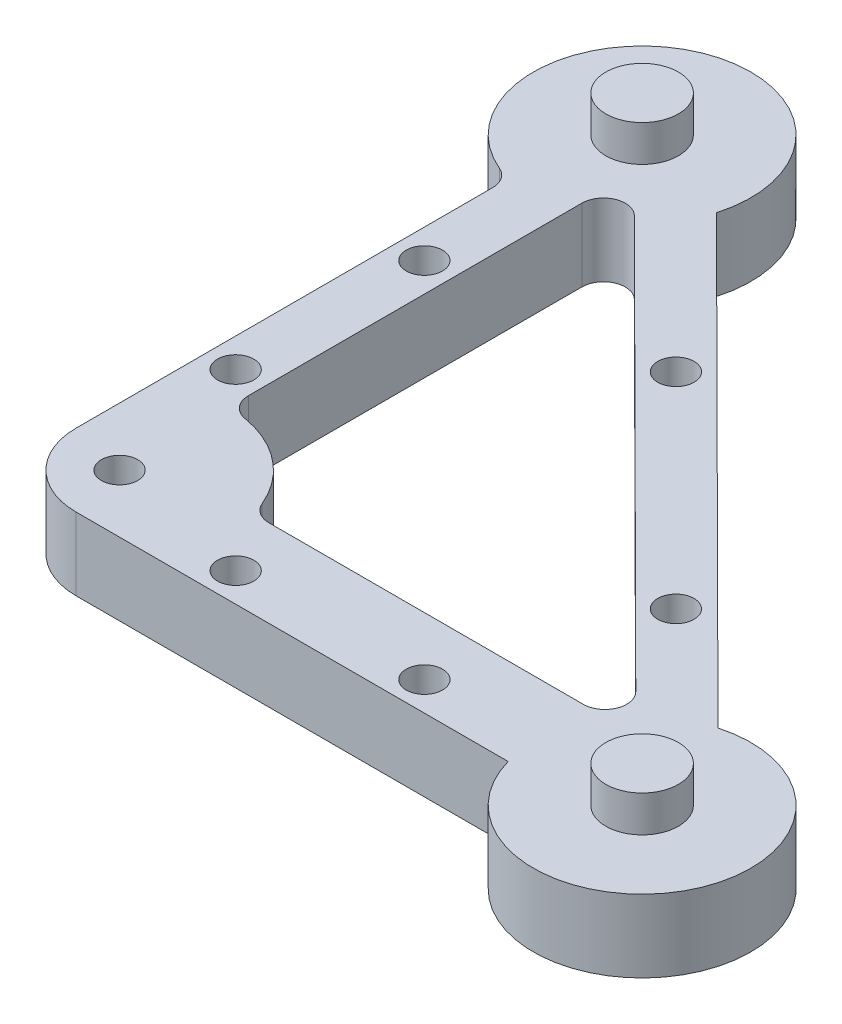
ISO-10303-21;
HEADER;
FILE_DESCRIPTION(('STEP AP214'),'2;1');
FILE_NAME('part.step','',(''),(''),'','','');
FILE_SCHEMA(('AUTOMOTIVE_DESIGN { 1 0 10303 214 1 1 1 1 }'));
ENDSEC;
DATA;
#1=APPLICATION_CONTEXT('core data for automotive mechanical design processes');
#2=APPLICATION_PROTOCOL_DEFINITION('international standard','automotive_design',2000,#1);
#3=PRODUCT_CONTEXT('',#1,'mechanical');
#4=PRODUCT('Part','Part','',(#3));
#5=PRODUCT_RELATED_PRODUCT_CATEGORY('part','',(#4));
#6=PRODUCT_DEFINITION_FORMATION('','',#4);
#7=PRODUCT_DEFINITION_CONTEXT('part definition',#1,'design');
#8=PRODUCT_DEFINITION('design','',#6,#7);
#9=PRODUCT_DEFINITION_SHAPE('','',#8);
#10=(LENGTH_UNIT() NAMED_UNIT(*) SI_UNIT(.MILLI.,.METRE.));
#11=(NAMED_UNIT(*) PLANE_ANGLE_UNIT() SI_UNIT($,.RADIAN.));
#12=(NAMED_UNIT(*) SI_UNIT($,.STERADIAN.) SOLID_ANGLE_UNIT());
#13=UNCERTAINTY_MEASURE_WITH_UNIT(LENGTH_MEASURE(1.E-05),#10,'distance_accuracy_value','');
#14=(GEOMETRIC_REPRESENTATION_CONTEXT(3) GLOBAL_UNCERTAINTY_ASSIGNED_CONTEXT((#13)) GLOBAL_UNIT_ASSIGNED_CONTEXT((#10,
#11,#12)) REPRESENTATION_CONTEXT('',''));
#15=CARTESIAN_POINT('',(0.,0.,0.));
#16=DIRECTION('',(0.,0.,1.));
#17=DIRECTION('',(1.,0.,0.));
#18=AXIS2_PLACEMENT_3D('',#15,#16,#17);
#19=CARTESIAN_POINT('',(-40.,10.,-80.));
#20=DIRECTION('',(0.,-1.,0.));
#21=DIRECTION('',(0.,0.,-1.));
#22=AXIS2_PLACEMENT_3D('',#19,#20,#21);
#23=CYLINDRICAL_SURFACE('',#22,15.);
#24=CARTESIAN_POINT('',(-40.,0.,-80.));
#25=DIRECTION('',(0.,1.,0.));
#26=DIRECTION('',(0.,0.,1.));
#27=AXIS2_PLACEMENT_3D('',#24,#25,#26);
#28=CIRCLE('',#27,15.);
#29=CARTESIAN_POINT('',(-25.5900581810937,0.,-75.8342375516917));
#30=VERTEX_POINT('',#29);
#31=CARTESIAN_POINT('',(-45.8333333333333,0.,-66.1807300401858));
#32=VERTEX_POINT('',#31);
#33=EDGE_CURVE('E178',#30,#32,#28,.T.);
#34=ORIENTED_EDGE('',*,*,#33,.T.);
#35=DIRECTION('',(0.,-1.,0.));
#36=VECTOR('',#35,1.);
#37=CARTESIAN_POINT('',(-45.8333333333333,10.,-66.1807300401858));
#38=LINE('',#37,#36);
#39=CARTESIAN_POINT('',(-45.8333333333333,10.,-66.1807300401858));
#40=VERTEX_POINT('',#39);
#41=EDGE_CURVE('E194',#32,#40,#38,.F.);
#42=ORIENTED_EDGE('',*,*,#41,.T.);
#43=CARTESIAN_POINT('',(-40.,10.,-80.));
#44=DIRECTION('',(0.,1.,0.));
#45=DIRECTION('',(0.,0.,1.));
#46=AXIS2_PLACEMENT_3D('',#43,#44,#45);
#47=CIRCLE('',#46,15.);
#48=CARTESIAN_POINT('',(-25.5900581810937,10.,-75.8342375516917));
#49=VERTEX_POINT('',#48);
#50=EDGE_CURVE('E172',#49,#40,#47,.T.);
#51=ORIENTED_EDGE('',*,*,#50,.F.);
#52=DIRECTION('',(0.,-1.,0.));
#53=VECTOR('',#52,1.);
#54=CARTESIAN_POINT('',(-25.5900581810937,10.,-75.8342375516917));
#55=LINE('',#54,#53);
#56=EDGE_CURVE('E177',#49,#30,#55,.T.);
#57=ORIENTED_EDGE('',*,*,#56,.T.);
#58=EDGE_LOOP('',(#34,#42,#51,#57));
#59=FACE_BOUND('',#58,.T.);
#60=ADVANCED_FACE('F39',(#59),#23,.T.);
#61=CARTESIAN_POINT('',(-44.,10.,-65.543167705199));
#62=DIRECTION('',(1.,0.,0.));
#63=DIRECTION('',(0.,0.,-1.));
#64=AXIS2_PLACEMENT_3D('',#61,#62,#63);
#65=PLANE('',#64);
#66=DIRECTION('',(0.,0.,1.));
#67=VECTOR('',#66,1.);
#68=CARTESIAN_POINT('',(-44.,0.,-65.543167705199));
#69=LINE('',#68,#67);
#70=CARTESIAN_POINT('',(-44.,0.,-63.416876048223));
#71=VERTEX_POINT('',#70);
#72=CARTESIAN_POINT('',(-44.,0.,-6.));
#73=VERTEX_POINT('',#72);
#74=EDGE_CURVE('E181',#71,#73,#69,.T.);
#75=ORIENTED_EDGE('',*,*,#74,.T.);
#76=DIRECTION('',(0.,-1.,0.));
#77=VECTOR('',#76,1.);
#78=CARTESIAN_POINT('',(-44.,10.,-6.));
#79=LINE('',#78,#77);
#80=CARTESIAN_POINT('',(-44.,10.,-6.));
#81=VERTEX_POINT('',#80);
#82=EDGE_CURVE('E47',#73,#81,#79,.F.);
#83=ORIENTED_EDGE('',*,*,#82,.T.);
#84=DIRECTION('',(0.,0.,1.));
#85=VECTOR('',#84,1.);
#86=CARTESIAN_POINT('',(-44.,10.,-65.543167705199));
#87=LINE('',#86,#85);
#88=CARTESIAN_POINT('',(-44.,10.,-63.416876048223));
#89=VERTEX_POINT('',#88);
#90=EDGE_CURVE('E170',#89,#81,#87,.T.);
#91=ORIENTED_EDGE('',*,*,#90,.F.);
#92=DIRECTION('',(0.,1.,0.));
#93=VECTOR('',#92,1.);
#94=CARTESIAN_POINT('',(-44.,0.,-63.416876048223));
#95=LINE('',#94,#93);
#96=EDGE_CURVE('E157',#89,#71,#95,.F.);
#97=ORIENTED_EDGE('',*,*,#96,.T.);
#98=EDGE_LOOP('',(#75,#83,#91,#97));
#99=FACE_BOUND('',#98,.T.);
#100=ADVANCED_FACE('F256',(#99),#65,.F.);
#101=CARTESIAN_POINT('',(25.543167705199,10.,4.));
#102=DIRECTION('',(0.,0.,1.));
#103=DIRECTION('',(1.,0.,0.));
#104=AXIS2_PLACEMENT_3D('',#101,#102,#103);
#105=PLANE('',#104);
#106=DIRECTION('',(-1.,0.,0.));
#107=VECTOR('',#106,1.);
#108=CARTESIAN_POINT('',(25.543167705199,10.,4.));
#109=LINE('',#108,#107);
#110=CARTESIAN_POINT('',(25.543167705199,10.,4.));
#111=VERTEX_POINT('',#110);
#112=CARTESIAN_POINT('',(-34.,10.,4.));
#113=VERTEX_POINT('',#112);
#114=EDGE_CURVE('E151',#111,#113,#109,.T.);
#115=ORIENTED_EDGE('',*,*,#114,.T.);
#116=DIRECTION('',(0.,-1.,0.));
#117=VECTOR('',#116,1.);
#118=CARTESIAN_POINT('',(-34.,0.,4.));
#119=LINE('',#118,#117);
#120=CARTESIAN_POINT('',(-34.,0.,4.));
#121=VERTEX_POINT('',#120);
#122=EDGE_CURVE('E240',#113,#121,#119,.T.);
#123=ORIENTED_EDGE('',*,*,#122,.T.);
#124=DIRECTION('',(-1.,0.,0.));
#125=VECTOR('',#124,1.);
#126=CARTESIAN_POINT('',(25.543167705199,0.,4.));
#127=LINE('',#126,#125);
#128=CARTESIAN_POINT('',(25.543167705199,0.,4.));
#129=VERTEX_POINT('',#128);
#130=EDGE_CURVE('E153',#129,#121,#127,.T.);
#131=ORIENTED_EDGE('',*,*,#130,.F.);
#132=DIRECTION('',(0.,-1.,0.));
#133=VECTOR('',#132,1.);
#134=CARTESIAN_POINT('',(25.543167705199,10.,4.));
#135=LINE('',#134,#133);
#136=EDGE_CURVE('E146',#111,#129,#135,.T.);
#137=ORIENTED_EDGE('',*,*,#136,.F.);
#138=EDGE_LOOP('',(#115,#123,#131,#137));
#139=FACE_BOUND('',#138,.T.);
#140=ADVANCED_FACE('F148',(#139),#105,.T.);
#141=CARTESIAN_POINT('',(40.,10.,0.));
#142=DIRECTION('',(0.,-1.,0.));
#143=DIRECTION('',(0.,0.,-1.));
#144=AXIS2_PLACEMENT_3D('',#141,#142,#143);
#145=CYLINDRICAL_SURFACE('',#144,15.);
#146=CARTESIAN_POINT('',(40.,0.,0.));
#147=DIRECTION('',(0.,1.,0.));
#148=DIRECTION('',(0.,0.,1.));
#149=AXIS2_PLACEMENT_3D('',#146,#147,#148);
#150=CIRCLE('',#149,15.);
#151=CARTESIAN_POINT('',(36.,0.,-14.456832294801));
#152=VERTEX_POINT('',#151);
#153=EDGE_CURVE('E185',#129,#152,#150,.T.);
#154=ORIENTED_EDGE('',*,*,#153,.T.);
#155=DIRECTION('',(0.,-1.,0.));
#156=VECTOR('',#155,1.);
#157=CARTESIAN_POINT('',(36.,10.,-14.456832294801));
#158=LINE('',#157,#156);
#159=CARTESIAN_POINT('',(36.,10.,-14.456832294801));
#160=VERTEX_POINT('',#159);
#161=EDGE_CURVE('E158',#160,#152,#158,.T.);
#162=ORIENTED_EDGE('',*,*,#161,.F.);
#163=CARTESIAN_POINT('',(40.,10.,0.));
#164=DIRECTION('',(0.,1.,0.));
#165=DIRECTION('',(0.,0.,1.));
#166=AXIS2_PLACEMENT_3D('',#163,#164,#165);
#167=CIRCLE('',#166,15.);
#168=EDGE_CURVE('E161',#111,#160,#167,.T.);
#169=ORIENTED_EDGE('',*,*,#168,.F.);
#170=ORIENTED_EDGE('',*,*,#136,.T.);
#171=EDGE_LOOP('',(#154,#162,#169,#170));
#172=FACE_BOUND('',#171,.T.);
#173=ADVANCED_FACE('F162',(#172),#145,.T.);
#174=CARTESIAN_POINT('',(-25.5900581810937,10.,-75.8342375516917));
#175=DIRECTION('',(0.705882895496767,0.,-0.708328552188249));
#176=DIRECTION('',(-0.708328552188249,0.,-0.705882895496767));
#177=AXIS2_PLACEMENT_3D('',#174,#175,#176);
#178=PLANE('',#177);
#179=DIRECTION('',(0.708328552188249,0.,0.705882895496767));
#180=VECTOR('',#179,1.);
#181=CARTESIAN_POINT('',(-25.5900581810937,0.,-75.8342375516917));
#182=LINE('',#181,#180);
#183=EDGE_CURVE('E187',#30,#152,#182,.T.);
#184=ORIENTED_EDGE('',*,*,#183,.F.);
#185=ORIENTED_EDGE('',*,*,#56,.F.);
#186=DIRECTION('',(0.708328552188249,0.,0.705882895496767));
#187=VECTOR('',#186,1.);
#188=CARTESIAN_POINT('',(-25.5900581810937,10.,-75.8342375516917));
#189=LINE('',#188,#187);
#190=EDGE_CURVE('E166',#49,#160,#189,.T.);
#191=ORIENTED_EDGE('',*,*,#190,.T.);
#192=ORIENTED_EDGE('',*,*,#161,.T.);
#193=EDGE_LOOP('',(#184,#185,#191,#192));
#194=FACE_BOUND('',#193,.T.);
#195=ADVANCED_FACE('F247',(#194),#178,.T.);
#196=CARTESIAN_POINT('',(-40.,10.,-80.));
#197=DIRECTION('',(0.,1.,0.));
#198=DIRECTION('',(0.,0.,1.));
#199=AXIS2_PLACEMENT_3D('',#196,#197,#198);
#200=PLANE('',#199);
#201=CARTESIAN_POINT('',(18.8861263291783,10.,-25.7668706084866));
#202=DIRECTION('',(0.,1.,0.));
#203=DIRECTION('',(0.,0.,1.));
#204=AXIS2_PLACEMENT_3D('',#201,#202,#203);
#205=CIRCLE('',#204,2.5);
#206=CARTESIAN_POINT('',(18.8861263291783,10.,-23.2668706084866));
#207=VERTEX_POINT('',#206);
#208=EDGE_CURVE('E633',#207,#207,#205,.T.);
#209=ORIENTED_EDGE('',*,*,#208,.F.);
#210=EDGE_LOOP('',(#209));
#211=FACE_BOUND('',#210,.T.);
#212=CARTESIAN_POINT('',(-9.39814491828355,10.,-54.0511418559485));
#213=DIRECTION('',(0.,1.,0.));
#214=DIRECTION('',(0.,0.,1.));
#215=AXIS2_PLACEMENT_3D('',#212,#213,#214);
#216=CIRCLE('',#215,2.5);
#217=CARTESIAN_POINT('',(-9.39814491828355,10.,-51.5511418559485));
#218=VERTEX_POINT('',#217);
#219=EDGE_CURVE('E635',#218,#218,#216,.T.);
#220=ORIENTED_EDGE('',*,*,#219,.F.);
#221=EDGE_LOOP('',(#220));
#222=FACE_BOUND('',#221,.T.);
#223=CARTESIAN_POINT('',(-36.,10.,-4.));
#224=DIRECTION('',(0.,-1.,0.));
#225=DIRECTION('',(0.,0.,1.));
#226=AXIS2_PLACEMENT_3D('',#223,#224,#225);
#227=CIRCLE('',#226,15.);
#228=CARTESIAN_POINT('',(-33.5,10.,-18.790199457749));
#229=VERTEX_POINT('',#228);
#230=CARTESIAN_POINT('',(-22.1807300401858,10.,-9.83333333333333));
#231=VERTEX_POINT('',#230);
#232=EDGE_CURVE('E312',#229,#231,#227,.T.);
#233=ORIENTED_EDGE('',*,*,#232,.F.);
#234=CARTESIAN_POINT('',(-33.,10.,-21.7482393492988));
#235=DIRECTION('',(0.,1.,0.));
#236=DIRECTION('',(0.,0.,1.));
#237=AXIS2_PLACEMENT_3D('',#234,#235,#236);
#238=CIRCLE('',#237,3.);
#239=CARTESIAN_POINT('',(-36.,10.,-21.7482393492988));
#240=VERTEX_POINT('',#239);
#241=EDGE_CURVE('E227',#229,#240,#238,.F.);
#242=ORIENTED_EDGE('',*,*,#241,.T.);
#243=DIRECTION('',(0.,0.,1.));
#244=VECTOR('',#243,1.);
#245=CARTESIAN_POINT('',(-36.,10.,-74.9140429260424));
#246=LINE('',#245,#244);
#247=CARTESIAN_POINT('',(-36.,10.,-67.6890783659095));
#248=VERTEX_POINT('',#247);
#249=EDGE_CURVE('E305',#248,#240,#246,.T.);
#250=ORIENTED_EDGE('',*,*,#249,.F.);
#251=CARTESIAN_POINT('',(-33.,10.,-67.6890783659095));
#252=DIRECTION('',(0.,1.,0.));
#253=DIRECTION('',(0.,0.,1.));
#254=AXIS2_PLACEMENT_3D('',#251,#252,#253);
#255=CIRCLE('',#254,3.);
#256=CARTESIAN_POINT('',(-30.8823513135097,10.,-69.8140640224743));
#257=VERTEX_POINT('',#256);
#258=EDGE_CURVE('E206',#248,#257,#255,.F.);
#259=ORIENTED_EDGE('',*,*,#258,.T.);
#260=DIRECTION('',(-0.708328552188249,0.,-0.705882895496767));
#261=VECTOR('',#260,1.);
#262=CARTESIAN_POINT('',(-36.,10.,-74.9140429260424));
#263=LINE('',#262,#261);
#264=CARTESIAN_POINT('',(26.0031364352083,10.,-13.1249856565647));
#265=VERTEX_POINT('',#264);
#266=EDGE_CURVE('E318',#265,#257,#263,.T.);
#267=ORIENTED_EDGE('',*,*,#266,.F.);
#268=CARTESIAN_POINT('',(23.8854877487179,10.,-11.));
#269=DIRECTION('',(0.,1.,0.));
#270=DIRECTION('',(0.,0.,1.));
#271=AXIS2_PLACEMENT_3D('',#268,#269,#270);
#272=CIRCLE('',#271,3.);
#273=CARTESIAN_POINT('',(23.8854877487179,10.,-7.99999999999999));
#274=VERTEX_POINT('',#273);
#275=EDGE_CURVE('E217',#265,#274,#272,.F.);
#276=ORIENTED_EDGE('',*,*,#275,.T.);
#277=DIRECTION('',(1.,0.,0.));
#278=VECTOR('',#277,1.);
#279=CARTESIAN_POINT('',(-21.543167705199,10.,-7.99999999999999));
#280=LINE('',#279,#278);
#281=CARTESIAN_POINT('',(-19.416876048223,10.,-7.99999999999999));
#282=VERTEX_POINT('',#281);
#283=EDGE_CURVE('E315',#282,#274,#280,.T.);
#284=ORIENTED_EDGE('',*,*,#283,.F.);
#285=CARTESIAN_POINT('',(-19.416876048223,10.,-11.));
#286=DIRECTION('',(0.,1.,0.));
#287=DIRECTION('',(0.,0.,1.));
#288=AXIS2_PLACEMENT_3D('',#285,#286,#287);
#289=CIRCLE('',#288,3.);
#290=EDGE_CURVE('E236',#282,#231,#289,.F.);
#291=ORIENTED_EDGE('',*,*,#290,.T.);
#292=EDGE_LOOP('',(#233,#242,#250,#259,#267,#276,#284,#291));
#293=FACE_BOUND('',#292,.T.);
#294=CARTESIAN_POINT('',(-36.,10.,-4.));
#295=DIRECTION('',(0.,1.,0.));
#296=DIRECTION('',(0.,0.,1.));
#297=AXIS2_PLACEMENT_3D('',#294,#295,#296);
#298=CIRCLE('',#297,2.5);
#299=CARTESIAN_POINT('',(-36.,10.,-1.5));
#300=VERTEX_POINT('',#299);
#301=EDGE_CURVE('E311',#300,#300,#298,.T.);
#302=ORIENTED_EDGE('',*,*,#301,.F.);
#303=EDGE_LOOP('',(#302));
#304=FACE_BOUND('',#303,.T.);
#305=CARTESIAN_POINT('',(-16.,10.,0.));
#306=DIRECTION('',(0.,1.,0.));
#307=DIRECTION('',(0.,0.,1.));
#308=AXIS2_PLACEMENT_3D('',#305,#306,#307);
#309=CIRCLE('',#308,2.5);
#310=CARTESIAN_POINT('',(-16.,10.,2.5));
#311=VERTEX_POINT('',#310);
#312=EDGE_CURVE('E325',#311,#311,#309,.T.);
#313=ORIENTED_EDGE('',*,*,#312,.F.);
#314=EDGE_LOOP('',(#313));
#315=FACE_BOUND('',#314,.T.);
#316=CARTESIAN_POINT('',(10.,10.,0.));
#317=DIRECTION('',(0.,1.,0.));
#318=DIRECTION('',(0.,0.,1.));
#319=AXIS2_PLACEMENT_3D('',#316,#317,#318);
#320=CIRCLE('',#319,2.5);
#321=CARTESIAN_POINT('',(10.,10.,2.5));
#322=VERTEX_POINT('',#321);
#323=EDGE_CURVE('E331',#322,#322,#320,.T.);
#324=ORIENTED_EDGE('',*,*,#323,.F.);
#325=EDGE_LOOP('',(#324));
#326=FACE_BOUND('',#325,.T.);
#327=CARTESIAN_POINT('',(-40.,10.,-24.));
#328=DIRECTION('',(0.,1.,0.));
#329=DIRECTION('',(0.,0.,1.));
#330=AXIS2_PLACEMENT_3D('',#327,#328,#329);
#331=CIRCLE('',#330,2.5);
#332=CARTESIAN_POINT('',(-40.,10.,-21.5));
#333=VERTEX_POINT('',#332);
#334=EDGE_CURVE('E337',#333,#333,#331,.T.);
#335=ORIENTED_EDGE('',*,*,#334,.F.);
#336=EDGE_LOOP('',(#335));
#337=FACE_BOUND('',#336,.T.);
#338=CARTESIAN_POINT('',(-40.,10.,-50.));
#339=DIRECTION('',(0.,1.,0.));
#340=DIRECTION('',(0.,0.,1.));
#341=AXIS2_PLACEMENT_3D('',#338,#339,#340);
#342=CIRCLE('',#341,2.5);
#343=CARTESIAN_POINT('',(-40.,10.,-47.5));
#344=VERTEX_POINT('',#343);
#345=EDGE_CURVE('E343',#344,#344,#342,.T.);
#346=ORIENTED_EDGE('',*,*,#345,.F.);
#347=EDGE_LOOP('',(#346));
#348=FACE_BOUND('',#347,.T.);
#349=CARTESIAN_POINT('',(40.,10.,0.));
#350=DIRECTION('',(0.,1.,0.));
#351=DIRECTION('',(0.,0.,1.));
#352=AXIS2_PLACEMENT_3D('',#349,#350,#351);
#353=CIRCLE('',#352,5.);
#354=CARTESIAN_POINT('',(40.,10.,5.));
#355=VERTEX_POINT('',#354);
#356=EDGE_CURVE('E349',#355,#355,#353,.T.);
#357=ORIENTED_EDGE('',*,*,#356,.F.);
#358=EDGE_LOOP('',(#357));
#359=FACE_BOUND('',#358,.T.);
#360=CARTESIAN_POINT('',(-40.,10.,-80.));
#361=DIRECTION('',(0.,1.,0.));
#362=DIRECTION('',(0.,0.,1.));
#363=AXIS2_PLACEMENT_3D('',#360,#361,#362);
#364=CIRCLE('',#363,5.);
#365=CARTESIAN_POINT('',(-40.,10.,-75.));
#366=VERTEX_POINT('',#365);
#367=EDGE_CURVE('E355',#366,#366,#364,.T.);
#368=ORIENTED_EDGE('',*,*,#367,.F.);
#369=EDGE_LOOP('',(#368));
#370=FACE_BOUND('',#369,.T.);
#371=ORIENTED_EDGE('',*,*,#90,.T.);
#372=CARTESIAN_POINT('',(-34.,10.,-6.));
#373=DIRECTION('',(0.,1.,0.));
#374=DIRECTION('',(0.,0.,1.));
#375=AXIS2_PLACEMENT_3D('',#372,#373,#374);
#376=CIRCLE('',#375,10.);
#377=EDGE_CURVE('E11',#81,#113,#376,.T.);
#378=ORIENTED_EDGE('',*,*,#377,.T.);
#379=ORIENTED_EDGE('',*,*,#114,.F.);
#380=ORIENTED_EDGE('',*,*,#168,.T.);
#381=ORIENTED_EDGE('',*,*,#190,.F.);
#382=ORIENTED_EDGE('',*,*,#50,.T.);
#383=CARTESIAN_POINT('',(-47.,10.,-63.416876048223));
#384=DIRECTION('',(0.,1.,0.));
#385=DIRECTION('',(0.,0.,1.));
#386=AXIS2_PLACEMENT_3D('',#383,#384,#385);
#387=CIRCLE('',#386,3.);
#388=EDGE_CURVE('E198',#40,#89,#387,.F.);
#389=ORIENTED_EDGE('',*,*,#388,.T.);
#390=EDGE_LOOP('',(#371,#378,#379,#380,#381,#382,#389));
#391=FACE_BOUND('',#390,.T.);
#392=ADVANCED_FACE('F168',(#211,#222,#293,#304,#315,#326,#337,#348,#359,#370,#391),#200,.T.);
#393=CARTESIAN_POINT('',(-40.,0.,-80.));
#394=DIRECTION('',(0.,1.,0.));
#395=DIRECTION('',(0.,0.,1.));
#396=AXIS2_PLACEMENT_3D('',#393,#394,#395);
#397=PLANE('',#396);
#398=CARTESIAN_POINT('',(18.8861263291783,0.,-25.7668706084866));
#399=DIRECTION('',(0.,1.,0.));
#400=DIRECTION('',(0.,0.,1.));
#401=AXIS2_PLACEMENT_3D('',#398,#399,#400);
#402=CIRCLE('',#401,2.5);
#403=CARTESIAN_POINT('',(18.8861263291783,0.,-23.2668706084866));
#404=VERTEX_POINT('',#403);
#405=EDGE_CURVE('E631',#404,#404,#402,.T.);
#406=ORIENTED_EDGE('',*,*,#405,.T.);
#407=EDGE_LOOP('',(#406));
#408=FACE_BOUND('',#407,.T.);
#409=CARTESIAN_POINT('',(-9.39814491828355,0.,-54.0511418559485));
#410=DIRECTION('',(0.,1.,0.));
#411=DIRECTION('',(0.,0.,1.));
#412=AXIS2_PLACEMENT_3D('',#409,#410,#411);
#413=CIRCLE('',#412,2.5);
#414=CARTESIAN_POINT('',(-9.39814491828355,0.,-51.5511418559485));
#415=VERTEX_POINT('',#414);
#416=EDGE_CURVE('E316',#415,#415,#413,.T.);
#417=ORIENTED_EDGE('',*,*,#416,.T.);
#418=EDGE_LOOP('',(#417));
#419=FACE_BOUND('',#418,.T.);
#420=CARTESIAN_POINT('',(-36.,0.,-4.));
#421=DIRECTION('',(0.,-1.,0.));
#422=DIRECTION('',(0.,0.,1.));
#423=AXIS2_PLACEMENT_3D('',#420,#421,#422);
#424=CIRCLE('',#423,15.);
#425=CARTESIAN_POINT('',(-33.5,0.,-18.790199457749));
#426=VERTEX_POINT('',#425);
#427=CARTESIAN_POINT('',(-22.1807300401858,0.,-9.83333333333333));
#428=VERTEX_POINT('',#427);
#429=EDGE_CURVE('E296',#426,#428,#424,.T.);
#430=ORIENTED_EDGE('',*,*,#429,.T.);
#431=CARTESIAN_POINT('',(-19.416876048223,0.,-11.));
#432=DIRECTION('',(0.,1.,0.));
#433=DIRECTION('',(0.,0.,1.));
#434=AXIS2_PLACEMENT_3D('',#431,#432,#433);
#435=CIRCLE('',#434,3.);
#436=CARTESIAN_POINT('',(-19.416876048223,0.,-7.99999999999999));
#437=VERTEX_POINT('',#436);
#438=EDGE_CURVE('E238',#428,#437,#435,.T.);
#439=ORIENTED_EDGE('',*,*,#438,.T.);
#440=DIRECTION('',(1.,0.,0.));
#441=VECTOR('',#440,1.);
#442=CARTESIAN_POINT('',(-21.543167705199,0.,-7.99999999999999));
#443=LINE('',#442,#441);
#444=CARTESIAN_POINT('',(23.8854877487179,0.,-7.99999999999999));
#445=VERTEX_POINT('',#444);
#446=EDGE_CURVE('E294',#437,#445,#443,.T.);
#447=ORIENTED_EDGE('',*,*,#446,.T.);
#448=CARTESIAN_POINT('',(23.8854877487179,0.,-11.));
#449=DIRECTION('',(0.,1.,0.));
#450=DIRECTION('',(0.,0.,1.));
#451=AXIS2_PLACEMENT_3D('',#448,#449,#450);
#452=CIRCLE('',#451,3.);
#453=CARTESIAN_POINT('',(26.0031364352083,0.,-13.1249856565647));
#454=VERTEX_POINT('',#453);
#455=EDGE_CURVE('E220',#445,#454,#452,.T.);
#456=ORIENTED_EDGE('',*,*,#455,.T.);
#457=DIRECTION('',(-0.708328552188249,0.,-0.705882895496767));
#458=VECTOR('',#457,1.);
#459=CARTESIAN_POINT('',(-36.,0.,-74.9140429260424));
#460=LINE('',#459,#458);
#461=CARTESIAN_POINT('',(-30.8823513135097,0.,-69.8140640224743));
#462=VERTEX_POINT('',#461);
#463=EDGE_CURVE('E301',#454,#462,#460,.T.);
#464=ORIENTED_EDGE('',*,*,#463,.T.);
#465=CARTESIAN_POINT('',(-33.,0.,-67.6890783659095));
#466=DIRECTION('',(0.,1.,0.));
#467=DIRECTION('',(0.,0.,1.));
#468=AXIS2_PLACEMENT_3D('',#465,#466,#467);
#469=CIRCLE('',#468,3.);
#470=CARTESIAN_POINT('',(-36.,0.,-67.6890783659095));
#471=VERTEX_POINT('',#470);
#472=EDGE_CURVE('E209',#462,#471,#469,.T.);
#473=ORIENTED_EDGE('',*,*,#472,.T.);
#474=DIRECTION('',(0.,0.,1.));
#475=VECTOR('',#474,1.);
#476=CARTESIAN_POINT('',(-36.,0.,-74.9140429260424));
#477=LINE('',#476,#475);
#478=CARTESIAN_POINT('',(-36.,0.,-21.7482393492988));
#479=VERTEX_POINT('',#478);
#480=EDGE_CURVE('E303',#471,#479,#477,.T.);
#481=ORIENTED_EDGE('',*,*,#480,.T.);
#482=CARTESIAN_POINT('',(-33.,0.,-21.7482393492988));
#483=DIRECTION('',(0.,1.,0.));
#484=DIRECTION('',(0.,0.,1.));
#485=AXIS2_PLACEMENT_3D('',#482,#483,#484);
#486=CIRCLE('',#485,3.);
#487=EDGE_CURVE('E229',#479,#426,#486,.T.);
#488=ORIENTED_EDGE('',*,*,#487,.T.);
#489=EDGE_LOOP('',(#430,#439,#447,#456,#464,#473,#481,#488));
#490=FACE_BOUND('',#489,.T.);
#491=CARTESIAN_POINT('',(-36.,0.,-4.));
#492=DIRECTION('',(0.,1.,0.));
#493=DIRECTION('',(0.,0.,1.));
#494=AXIS2_PLACEMENT_3D('',#491,#492,#493);
#495=CIRCLE('',#494,2.5);
#496=CARTESIAN_POINT('',(-36.,0.,-1.5));
#497=VERTEX_POINT('',#496);
#498=EDGE_CURVE('E322',#497,#497,#495,.T.);
#499=ORIENTED_EDGE('',*,*,#498,.T.);
#500=EDGE_LOOP('',(#499));
#501=FACE_BOUND('',#500,.T.);
#502=CARTESIAN_POINT('',(-16.,0.,0.));
#503=DIRECTION('',(0.,1.,0.));
#504=DIRECTION('',(0.,0.,1.));
#505=AXIS2_PLACEMENT_3D('',#502,#503,#504);
#506=CIRCLE('',#505,2.5);
#507=CARTESIAN_POINT('',(-16.,0.,2.5));
#508=VERTEX_POINT('',#507);
#509=EDGE_CURVE('E328',#508,#508,#506,.T.);
#510=ORIENTED_EDGE('',*,*,#509,.T.);
#511=EDGE_LOOP('',(#510));
#512=FACE_BOUND('',#511,.T.);
#513=CARTESIAN_POINT('',(10.,0.,0.));
#514=DIRECTION('',(0.,1.,0.));
#515=DIRECTION('',(0.,0.,1.));
#516=AXIS2_PLACEMENT_3D('',#513,#514,#515);
#517=CIRCLE('',#516,2.5);
#518=CARTESIAN_POINT('',(10.,0.,2.5));
#519=VERTEX_POINT('',#518);
#520=EDGE_CURVE('E334',#519,#519,#517,.T.);
#521=ORIENTED_EDGE('',*,*,#520,.T.);
#522=EDGE_LOOP('',(#521));
#523=FACE_BOUND('',#522,.T.);
#524=CARTESIAN_POINT('',(-40.,0.,-24.));
#525=DIRECTION('',(0.,1.,0.));
#526=DIRECTION('',(0.,0.,1.));
#527=AXIS2_PLACEMENT_3D('',#524,#525,#526);
#528=CIRCLE('',#527,2.5);
#529=CARTESIAN_POINT('',(-40.,0.,-21.5));
#530=VERTEX_POINT('',#529);
#531=EDGE_CURVE('E340',#530,#530,#528,.T.);
#532=ORIENTED_EDGE('',*,*,#531,.T.);
#533=EDGE_LOOP('',(#532));
#534=FACE_BOUND('',#533,.T.);
#535=CARTESIAN_POINT('',(-40.,0.,-50.));
#536=DIRECTION('',(0.,1.,0.));
#537=DIRECTION('',(0.,0.,1.));
#538=AXIS2_PLACEMENT_3D('',#535,#536,#537);
#539=CIRCLE('',#538,2.5);
#540=CARTESIAN_POINT('',(-40.,0.,-47.5));
#541=VERTEX_POINT('',#540);
#542=EDGE_CURVE('E346',#541,#541,#539,.T.);
#543=ORIENTED_EDGE('',*,*,#542,.T.);
#544=EDGE_LOOP('',(#543));
#545=FACE_BOUND('',#544,.T.);
#546=ORIENTED_EDGE('',*,*,#130,.T.);
#547=CARTESIAN_POINT('',(-34.,0.,-6.));
#548=DIRECTION('',(0.,1.,0.));
#549=DIRECTION('',(0.,0.,1.));
#550=AXIS2_PLACEMENT_3D('',#547,#548,#549);
#551=CIRCLE('',#550,10.);
#552=EDGE_CURVE('E61',#121,#73,#551,.F.);
#553=ORIENTED_EDGE('',*,*,#552,.T.);
#554=ORIENTED_EDGE('',*,*,#74,.F.);
#555=CARTESIAN_POINT('',(-47.,0.,-63.416876048223));
#556=DIRECTION('',(0.,1.,0.));
#557=DIRECTION('',(0.,0.,1.));
#558=AXIS2_PLACEMENT_3D('',#555,#556,#557);
#559=CIRCLE('',#558,3.);
#560=EDGE_CURVE('E196',#71,#32,#559,.T.);
#561=ORIENTED_EDGE('',*,*,#560,.T.);
#562=ORIENTED_EDGE('',*,*,#33,.F.);
#563=ORIENTED_EDGE('',*,*,#183,.T.);
#564=ORIENTED_EDGE('',*,*,#153,.F.);
#565=EDGE_LOOP('',(#546,#553,#554,#561,#562,#563,#564));
#566=FACE_BOUND('',#565,.T.);
#567=ADVANCED_FACE('F243',(#408,#419,#490,#501,#512,#523,#534,#545,#566),#397,.F.);
#568=CARTESIAN_POINT('',(-40.,15.,-80.));
#569=DIRECTION('',(0.,-1.,0.));
#570=DIRECTION('',(0.,0.,-1.));
#571=AXIS2_PLACEMENT_3D('',#568,#569,#570);
#572=CYLINDRICAL_SURFACE('',#571,5.);
#573=CARTESIAN_POINT('',(-40.,15.,-80.));
#574=DIRECTION('',(0.,1.,0.));
#575=DIRECTION('',(0.,0.,1.));
#576=AXIS2_PLACEMENT_3D('',#573,#574,#575);
#577=CIRCLE('',#576,5.);
#578=CARTESIAN_POINT('',(-40.,15.,-75.));
#579=VERTEX_POINT('',#578);
#580=EDGE_CURVE('E182',#579,#579,#577,.T.);
#581=ORIENTED_EDGE('',*,*,#580,.F.);
#582=EDGE_LOOP('',(#581));
#583=FACE_BOUND('',#582,.T.);
#584=ORIENTED_EDGE('',*,*,#367,.T.);
#585=EDGE_LOOP('',(#584));
#586=FACE_BOUND('',#585,.T.);
#587=ADVANCED_FACE('F363',(#583,#586),#572,.T.);
#588=CARTESIAN_POINT('',(-40.,15.,-80.));
#589=DIRECTION('',(0.,1.,0.));
#590=DIRECTION('',(0.,0.,1.));
#591=AXIS2_PLACEMENT_3D('',#588,#589,#590);
#592=PLANE('',#591);
#593=ORIENTED_EDGE('',*,*,#580,.T.);
#594=EDGE_LOOP('',(#593));
#595=FACE_BOUND('',#594,.T.);
#596=ADVANCED_FACE('F404',(#595),#592,.T.);
#597=CARTESIAN_POINT('',(40.,15.,0.));
#598=DIRECTION('',(0.,-1.,0.));
#599=DIRECTION('',(0.,0.,-1.));
#600=AXIS2_PLACEMENT_3D('',#597,#598,#599);
#601=CYLINDRICAL_SURFACE('',#600,5.);
#602=CARTESIAN_POINT('',(40.,15.,0.));
#603=DIRECTION('',(0.,1.,0.));
#604=DIRECTION('',(0.,0.,1.));
#605=AXIS2_PLACEMENT_3D('',#602,#603,#604);
#606=CIRCLE('',#605,5.);
#607=CARTESIAN_POINT('',(40.,15.,5.));
#608=VERTEX_POINT('',#607);
#609=EDGE_CURVE('E352',#608,#608,#606,.T.);
#610=ORIENTED_EDGE('',*,*,#609,.F.);
#611=EDGE_LOOP('',(#610));
#612=FACE_BOUND('',#611,.T.);
#613=ORIENTED_EDGE('',*,*,#356,.T.);
#614=EDGE_LOOP('',(#613));
#615=FACE_BOUND('',#614,.T.);
#616=ADVANCED_FACE('F414',(#612,#615),#601,.T.);
#617=CARTESIAN_POINT('',(40.,15.,0.));
#618=DIRECTION('',(0.,1.,0.));
#619=DIRECTION('',(0.,0.,1.));
#620=AXIS2_PLACEMENT_3D('',#617,#618,#619);
#621=PLANE('',#620);
#622=ORIENTED_EDGE('',*,*,#609,.T.);
#623=EDGE_LOOP('',(#622));
#624=FACE_BOUND('',#623,.T.);
#625=ADVANCED_FACE('F423',(#624),#621,.T.);
#626=CARTESIAN_POINT('',(-40.,0.,-50.));
#627=DIRECTION('',(0.,1.,0.));
#628=DIRECTION('',(0.,0.,1.));
#629=AXIS2_PLACEMENT_3D('',#626,#627,#628);
#630=CYLINDRICAL_SURFACE('',#629,2.5);
#631=ORIENTED_EDGE('',*,*,#542,.F.);
#632=EDGE_LOOP('',(#631));
#633=FACE_BOUND('',#632,.T.);
#634=ORIENTED_EDGE('',*,*,#345,.T.);
#635=EDGE_LOOP('',(#634));
#636=FACE_BOUND('',#635,.T.);
#637=ADVANCED_FACE('F433',(#633,#636),#630,.F.);
#638=CARTESIAN_POINT('',(-40.,0.,-24.));
#639=DIRECTION('',(0.,1.,0.));
#640=DIRECTION('',(0.,0.,1.));
#641=AXIS2_PLACEMENT_3D('',#638,#639,#640);
#642=CYLINDRICAL_SURFACE('',#641,2.5);
#643=ORIENTED_EDGE('',*,*,#531,.F.);
#644=EDGE_LOOP('',(#643));
#645=FACE_BOUND('',#644,.T.);
#646=ORIENTED_EDGE('',*,*,#334,.T.);
#647=EDGE_LOOP('',(#646));
#648=FACE_BOUND('',#647,.T.);
#649=ADVANCED_FACE('F443',(#645,#648),#642,.F.);
#650=CARTESIAN_POINT('',(10.,0.,0.));
#651=DIRECTION('',(0.,1.,0.));
#652=DIRECTION('',(0.,0.,1.));
#653=AXIS2_PLACEMENT_3D('',#650,#651,#652);
#654=CYLINDRICAL_SURFACE('',#653,2.5);
#655=ORIENTED_EDGE('',*,*,#520,.F.);
#656=EDGE_LOOP('',(#655));
#657=FACE_BOUND('',#656,.T.);
#658=ORIENTED_EDGE('',*,*,#323,.T.);
#659=EDGE_LOOP('',(#658));
#660=FACE_BOUND('',#659,.T.);
#661=ADVANCED_FACE('F453',(#657,#660),#654,.F.);
#662=CARTESIAN_POINT('',(-16.,0.,0.));
#663=DIRECTION('',(0.,1.,0.));
#664=DIRECTION('',(0.,0.,1.));
#665=AXIS2_PLACEMENT_3D('',#662,#663,#664);
#666=CYLINDRICAL_SURFACE('',#665,2.5);
#667=ORIENTED_EDGE('',*,*,#509,.F.);
#668=EDGE_LOOP('',(#667));
#669=FACE_BOUND('',#668,.T.);
#670=ORIENTED_EDGE('',*,*,#312,.T.);
#671=EDGE_LOOP('',(#670));
#672=FACE_BOUND('',#671,.T.);
#673=ADVANCED_FACE('F463',(#669,#672),#666,.F.);
#674=CARTESIAN_POINT('',(-36.,0.,-4.));
#675=DIRECTION('',(0.,1.,0.));
#676=DIRECTION('',(0.,0.,1.));
#677=AXIS2_PLACEMENT_3D('',#674,#675,#676);
#678=CYLINDRICAL_SURFACE('',#677,2.5);
#679=ORIENTED_EDGE('',*,*,#498,.F.);
#680=EDGE_LOOP('',(#679));
#681=FACE_BOUND('',#680,.T.);
#682=ORIENTED_EDGE('',*,*,#301,.T.);
#683=EDGE_LOOP('',(#682));
#684=FACE_BOUND('',#683,.T.);
#685=ADVANCED_FACE('F473',(#681,#684),#678,.F.);
#686=CARTESIAN_POINT('',(-36.,0.,-4.));
#687=DIRECTION('',(0.,1.,0.));
#688=DIRECTION('',(0.,0.,1.));
#689=AXIS2_PLACEMENT_3D('',#686,#687,#688);
#690=CYLINDRICAL_SURFACE('',#689,15.);
#691=ORIENTED_EDGE('',*,*,#232,.T.);
#692=DIRECTION('',(0.,1.,0.));
#693=VECTOR('',#692,1.);
#694=CARTESIAN_POINT('',(-22.1807300401858,0.,-9.83333333333333));
#695=LINE('',#694,#693);
#696=EDGE_CURVE('E234',#231,#428,#695,.F.);
#697=ORIENTED_EDGE('',*,*,#696,.T.);
#698=ORIENTED_EDGE('',*,*,#429,.F.);
#699=DIRECTION('',(0.,1.,0.));
#700=VECTOR('',#699,1.);
#701=CARTESIAN_POINT('',(-33.5,0.,-18.790199457749));
#702=LINE('',#701,#700);
#703=EDGE_CURVE('E222',#426,#229,#702,.T.);
#704=ORIENTED_EDGE('',*,*,#703,.T.);
#705=EDGE_LOOP('',(#691,#697,#698,#704));
#706=FACE_BOUND('',#705,.T.);
#707=ADVANCED_FACE('F482',(#706),#690,.T.);
#708=CARTESIAN_POINT('',(-36.,0.,-74.9140429260424));
#709=DIRECTION('',(-1.,0.,0.));
#710=DIRECTION('',(0.,0.,1.));
#711=AXIS2_PLACEMENT_3D('',#708,#709,#710);
#712=PLANE('',#711);
#713=ORIENTED_EDGE('',*,*,#249,.T.);
#714=DIRECTION('',(0.,-1.,0.));
#715=VECTOR('',#714,1.);
#716=CARTESIAN_POINT('',(-36.,0.,-21.7482393492988));
#717=LINE('',#716,#715);
#718=EDGE_CURVE('E225',#240,#479,#717,.T.);
#719=ORIENTED_EDGE('',*,*,#718,.T.);
#720=ORIENTED_EDGE('',*,*,#480,.F.);
#721=DIRECTION('',(0.,1.,0.));
#722=VECTOR('',#721,1.);
#723=CARTESIAN_POINT('',(-36.,10.,-67.6890783659095));
#724=LINE('',#723,#722);
#725=EDGE_CURVE('E200',#471,#248,#724,.T.);
#726=ORIENTED_EDGE('',*,*,#725,.T.);
#727=EDGE_LOOP('',(#713,#719,#720,#726));
#728=FACE_BOUND('',#727,.T.);
#729=ADVANCED_FACE('F534',(#728),#712,.F.);
#730=CARTESIAN_POINT('',(-36.,0.,-74.9140429260424));
#731=DIRECTION('',(0.705882895496767,0.,-0.708328552188248));
#732=DIRECTION('',(-0.708328552188249,0.,-0.705882895496767));
#733=AXIS2_PLACEMENT_3D('',#730,#731,#732);
#734=PLANE('',#733);
#735=ORIENTED_EDGE('',*,*,#463,.F.);
#736=DIRECTION('',(0.,1.,0.));
#737=VECTOR('',#736,1.);
#738=CARTESIAN_POINT('',(26.0031364352082,10.,-13.1249856565647));
#739=LINE('',#738,#737);
#740=EDGE_CURVE('E211',#454,#265,#739,.T.);
#741=ORIENTED_EDGE('',*,*,#740,.T.);
#742=ORIENTED_EDGE('',*,*,#266,.T.);
#743=DIRECTION('',(0.,1.,0.));
#744=VECTOR('',#743,1.);
#745=CARTESIAN_POINT('',(-30.8823513135097,0.,-69.8140640224743));
#746=LINE('',#745,#744);
#747=EDGE_CURVE('E203',#257,#462,#746,.F.);
#748=ORIENTED_EDGE('',*,*,#747,.T.);
#749=EDGE_LOOP('',(#735,#741,#742,#748));
#750=FACE_BOUND('',#749,.T.);
#751=ADVANCED_FACE('F529',(#750),#734,.F.);
#752=CARTESIAN_POINT('',(-21.543167705199,0.,-7.99999999999999));
#753=DIRECTION('',(0.,0.,1.));
#754=DIRECTION('',(1.,0.,0.));
#755=AXIS2_PLACEMENT_3D('',#752,#753,#754);
#756=PLANE('',#755);
#757=ORIENTED_EDGE('',*,*,#446,.F.);
#758=DIRECTION('',(0.,-1.,0.));
#759=VECTOR('',#758,1.);
#760=CARTESIAN_POINT('',(-19.416876048223,10.,-7.99999999999999));
#761=LINE('',#760,#759);
#762=EDGE_CURVE('E231',#437,#282,#761,.F.);
#763=ORIENTED_EDGE('',*,*,#762,.T.);
#764=ORIENTED_EDGE('',*,*,#283,.T.);
#765=DIRECTION('',(0.,1.,0.));
#766=VECTOR('',#765,1.);
#767=CARTESIAN_POINT('',(23.8854877487179,0.,-7.99999999999999));
#768=LINE('',#767,#766);
#769=EDGE_CURVE('E214',#274,#445,#768,.F.);
#770=ORIENTED_EDGE('',*,*,#769,.T.);
#771=EDGE_LOOP('',(#757,#763,#764,#770));
#772=FACE_BOUND('',#771,.T.);
#773=ADVANCED_FACE('F268',(#772),#756,.F.);
#774=CARTESIAN_POINT('',(-47.,10.,-63.416876048223));
#775=DIRECTION('',(0.,-1.,0.));
#776=DIRECTION('',(0.,0.,-1.));
#777=AXIS2_PLACEMENT_3D('',#774,#775,#776);
#778=CYLINDRICAL_SURFACE('',#777,3.);
#779=ORIENTED_EDGE('',*,*,#388,.F.);
#780=ORIENTED_EDGE('',*,*,#41,.F.);
#781=ORIENTED_EDGE('',*,*,#560,.F.);
#782=ORIENTED_EDGE('',*,*,#96,.F.);
#783=EDGE_LOOP('',(#779,#780,#781,#782));
#784=FACE_BOUND('',#783,.T.);
#785=ADVANCED_FACE('F255',(#784),#778,.F.);
#786=CARTESIAN_POINT('',(-9.39814491828355,0.,-54.0511418559485));
#787=DIRECTION('',(0.,1.,0.));
#788=DIRECTION('',(0.,0.,1.));
#789=AXIS2_PLACEMENT_3D('',#786,#787,#788);
#790=CYLINDRICAL_SURFACE('',#789,2.5);
#791=ORIENTED_EDGE('',*,*,#416,.F.);
#792=EDGE_LOOP('',(#791));
#793=FACE_BOUND('',#792,.T.);
#794=ORIENTED_EDGE('',*,*,#219,.T.);
#795=EDGE_LOOP('',(#794));
#796=FACE_BOUND('',#795,.T.);
#797=ADVANCED_FACE('F267',(#793,#796),#790,.F.);
#798=CARTESIAN_POINT('',(18.8861263291783,0.,-25.7668706084866));
#799=DIRECTION('',(0.,1.,0.));
#800=DIRECTION('',(0.,0.,1.));
#801=AXIS2_PLACEMENT_3D('',#798,#799,#800);
#802=CYLINDRICAL_SURFACE('',#801,2.5);
#803=ORIENTED_EDGE('',*,*,#405,.F.);
#804=EDGE_LOOP('',(#803));
#805=FACE_BOUND('',#804,.T.);
#806=ORIENTED_EDGE('',*,*,#208,.T.);
#807=EDGE_LOOP('',(#806));
#808=FACE_BOUND('',#807,.T.);
#809=ADVANCED_FACE('F273',(#805,#808),#802,.F.);
#810=CARTESIAN_POINT('',(-33.,0.,-67.6890783659095));
#811=DIRECTION('',(0.,-1.,0.));
#812=DIRECTION('',(0.,0.,-1.));
#813=AXIS2_PLACEMENT_3D('',#810,#811,#812);
#814=CYLINDRICAL_SURFACE('',#813,3.);
#815=ORIENTED_EDGE('',*,*,#472,.F.);
#816=ORIENTED_EDGE('',*,*,#747,.F.);
#817=ORIENTED_EDGE('',*,*,#258,.F.);
#818=ORIENTED_EDGE('',*,*,#725,.F.);
#819=EDGE_LOOP('',(#815,#816,#817,#818));
#820=FACE_BOUND('',#819,.T.);
#821=ADVANCED_FACE('F269',(#820),#814,.F.);
#822=CARTESIAN_POINT('',(23.8854877487179,0.,-11.));
#823=DIRECTION('',(0.,-1.,0.));
#824=DIRECTION('',(0.,0.,-1.));
#825=AXIS2_PLACEMENT_3D('',#822,#823,#824);
#826=CYLINDRICAL_SURFACE('',#825,3.);
#827=ORIENTED_EDGE('',*,*,#455,.F.);
#828=ORIENTED_EDGE('',*,*,#769,.F.);
#829=ORIENTED_EDGE('',*,*,#275,.F.);
#830=ORIENTED_EDGE('',*,*,#740,.F.);
#831=EDGE_LOOP('',(#827,#828,#829,#830));
#832=FACE_BOUND('',#831,.T.);
#833=ADVANCED_FACE('F272',(#832),#826,.F.);
#834=CARTESIAN_POINT('',(-33.,0.,-21.7482393492988));
#835=DIRECTION('',(0.,1.,0.));
#836=DIRECTION('',(0.,0.,1.));
#837=AXIS2_PLACEMENT_3D('',#834,#835,#836);
#838=CYLINDRICAL_SURFACE('',#837,3.);
#839=ORIENTED_EDGE('',*,*,#487,.F.);
#840=ORIENTED_EDGE('',*,*,#718,.F.);
#841=ORIENTED_EDGE('',*,*,#241,.F.);
#842=ORIENTED_EDGE('',*,*,#703,.F.);
#843=EDGE_LOOP('',(#839,#840,#841,#842));
#844=FACE_BOUND('',#843,.T.);
#845=ADVANCED_FACE('F277',(#844),#838,.F.);
#846=CARTESIAN_POINT('',(-19.416876048223,0.,-11.));
#847=DIRECTION('',(0.,1.,0.));
#848=DIRECTION('',(0.,0.,1.));
#849=AXIS2_PLACEMENT_3D('',#846,#847,#848);
#850=CYLINDRICAL_SURFACE('',#849,3.);
#851=ORIENTED_EDGE('',*,*,#438,.F.);
#852=ORIENTED_EDGE('',*,*,#696,.F.);
#853=ORIENTED_EDGE('',*,*,#290,.F.);
#854=ORIENTED_EDGE('',*,*,#762,.F.);
#855=EDGE_LOOP('',(#851,#852,#853,#854));
#856=FACE_BOUND('',#855,.T.);
#857=ADVANCED_FACE('F280',(#856),#850,.F.);
#858=CARTESIAN_POINT('',(-34.,10.,-6.));
#859=DIRECTION('',(0.,1.,0.));
#860=DIRECTION('',(0.,0.,1.));
#861=AXIS2_PLACEMENT_3D('',#858,#859,#860);
#862=CYLINDRICAL_SURFACE('',#861,10.);
#863=ORIENTED_EDGE('',*,*,#377,.F.);
#864=ORIENTED_EDGE('',*,*,#82,.F.);
#865=ORIENTED_EDGE('',*,*,#552,.F.);
#866=ORIENTED_EDGE('',*,*,#122,.F.);
#867=EDGE_LOOP('',(#863,#864,#865,#866));
#868=FACE_BOUND('',#867,.T.);
#869=ADVANCED_FACE('F41',(#868),#862,.T.);
#870=CLOSED_SHELL('',(#60,#100,#140,#173,#195,#392,#567,#587,#596,#616,#625,#637,#649,#661,#673,
#685,#707,#729,#751,#773,#785,#797,#809,#821,#833,#845,#857,#869));
#871=MANIFOLD_SOLID_BREP('B2',#870);
#872=ADVANCED_BREP_SHAPE_REPRESENTATION('',(#18,#871),#14);
#873=SHAPE_DEFINITION_REPRESENTATION(#9,#872);
ENDSEC;
END-ISO-10303-21;
